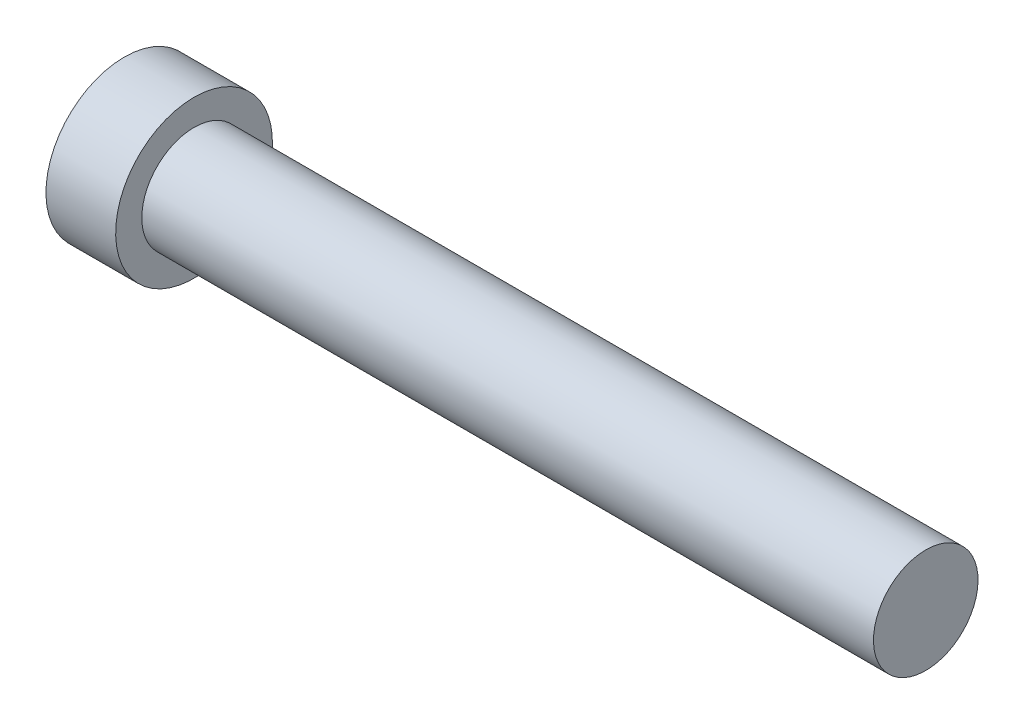
ISO-10303-21;
HEADER;
FILE_DESCRIPTION(('STEP AP214'),'2;1');
FILE_NAME('part.step','',(''),(''),'','','');
FILE_SCHEMA(('AUTOMOTIVE_DESIGN { 1 0 10303 214 1 1 1 1 }'));
ENDSEC;
DATA;
#1=APPLICATION_CONTEXT('core data for automotive mechanical design processes');
#2=APPLICATION_PROTOCOL_DEFINITION('international standard','automotive_design',2000,#1);
#3=PRODUCT_CONTEXT('',#1,'mechanical');
#4=PRODUCT('Part','Part','',(#3));
#5=PRODUCT_RELATED_PRODUCT_CATEGORY('part','',(#4));
#6=PRODUCT_DEFINITION_FORMATION('','',#4);
#7=PRODUCT_DEFINITION_CONTEXT('part definition',#1,'design');
#8=PRODUCT_DEFINITION('design','',#6,#7);
#9=PRODUCT_DEFINITION_SHAPE('','',#8);
#10=(LENGTH_UNIT() NAMED_UNIT(*) SI_UNIT(.MILLI.,.METRE.));
#11=(NAMED_UNIT(*) PLANE_ANGLE_UNIT() SI_UNIT($,.RADIAN.));
#12=(NAMED_UNIT(*) SI_UNIT($,.STERADIAN.) SOLID_ANGLE_UNIT());
#13=UNCERTAINTY_MEASURE_WITH_UNIT(LENGTH_MEASURE(1.E-05),#10,'distance_accuracy_value','');
#14=(GEOMETRIC_REPRESENTATION_CONTEXT(3) GLOBAL_UNCERTAINTY_ASSIGNED_CONTEXT((#13)) GLOBAL_UNIT_ASSIGNED_CONTEXT((#10,
#11,#12)) REPRESENTATION_CONTEXT('',''));
#15=CARTESIAN_POINT('',(0.,0.,0.));
#16=DIRECTION('',(0.,0.,1.));
#17=DIRECTION('',(1.,0.,0.));
#18=AXIS2_PLACEMENT_3D('',#15,#16,#17);
#19=CARTESIAN_POINT('',(0.,0.,0.));
#20=DIRECTION('',(-1.,0.,0.));
#21=DIRECTION('',(0.,-1.,0.));
#22=AXIS2_PLACEMENT_3D('',#19,#20,#21);
#23=PLANE('',#22);
#24=CARTESIAN_POINT('',(0.,0.,0.));
#25=DIRECTION('',(1.,0.,0.));
#26=DIRECTION('',(0.,1.,0.));
#27=AXIS2_PLACEMENT_3D('',#24,#25,#26);
#28=CIRCLE('',#27,22.5);
#29=CARTESIAN_POINT('',(0.,22.5,0.));
#30=VERTEX_POINT('',#29);
#31=EDGE_CURVE('E10',#30,#30,#28,.T.);
#32=ORIENTED_EDGE('',*,*,#31,.F.);
#33=EDGE_LOOP('',(#32));
#34=FACE_BOUND('',#33,.T.);
#35=ADVANCED_FACE('F35',(#34),#23,.T.);
#36=CARTESIAN_POINT('',(230.,0.,0.));
#37=DIRECTION('',(1.,0.,0.));
#38=DIRECTION('',(0.,1.,0.));
#39=AXIS2_PLACEMENT_3D('',#36,#37,#38);
#40=CYLINDRICAL_SURFACE('',#39,22.5);
#41=ORIENTED_EDGE('',*,*,#31,.T.);
#42=EDGE_LOOP('',(#41));
#43=FACE_BOUND('',#42,.T.);
#44=CARTESIAN_POINT('',(20.,0.,0.));
#45=DIRECTION('',(1.,0.,0.));
#46=DIRECTION('',(0.,1.,0.));
#47=AXIS2_PLACEMENT_3D('',#44,#45,#46);
#48=CIRCLE('',#47,22.5);
#49=CARTESIAN_POINT('',(20.,22.5,0.));
#50=VERTEX_POINT('',#49);
#51=EDGE_CURVE('E41',#50,#50,#48,.T.);
#52=ORIENTED_EDGE('',*,*,#51,.F.);
#53=EDGE_LOOP('',(#52));
#54=FACE_BOUND('',#53,.T.);
#55=ADVANCED_FACE('F67',(#43,#54),#40,.T.);
#56=CARTESIAN_POINT('',(20.,22.5,0.));
#57=DIRECTION('',(1.,0.,0.));
#58=DIRECTION('',(0.,1.,0.));
#59=AXIS2_PLACEMENT_3D('',#56,#57,#58);
#60=PLANE('',#59);
#61=ORIENTED_EDGE('',*,*,#51,.T.);
#62=EDGE_LOOP('',(#61));
#63=FACE_BOUND('',#62,.T.);
#64=CARTESIAN_POINT('',(20.,0.,0.));
#65=DIRECTION('',(1.,0.,0.));
#66=DIRECTION('',(0.,1.,0.));
#67=AXIS2_PLACEMENT_3D('',#64,#65,#66);
#68=CIRCLE('',#67,15.);
#69=CARTESIAN_POINT('',(20.,15.,0.));
#70=VERTEX_POINT('',#69);
#71=EDGE_CURVE('E45',#70,#70,#68,.T.);
#72=ORIENTED_EDGE('',*,*,#71,.F.);
#73=EDGE_LOOP('',(#72));
#74=FACE_BOUND('',#73,.T.);
#75=ADVANCED_FACE('F59',(#63,#74),#60,.T.);
#76=CARTESIAN_POINT('',(230.,0.,0.));
#77=DIRECTION('',(1.,0.,0.));
#78=DIRECTION('',(0.,1.,0.));
#79=AXIS2_PLACEMENT_3D('',#76,#77,#78);
#80=CYLINDRICAL_SURFACE('',#79,15.);
#81=ORIENTED_EDGE('',*,*,#71,.T.);
#82=EDGE_LOOP('',(#81));
#83=FACE_BOUND('',#82,.T.);
#84=CARTESIAN_POINT('',(230.,0.,0.));
#85=DIRECTION('',(1.,0.,0.));
#86=DIRECTION('',(0.,1.,0.));
#87=AXIS2_PLACEMENT_3D('',#84,#85,#86);
#88=CIRCLE('',#87,15.);
#89=CARTESIAN_POINT('',(230.,15.,0.));
#90=VERTEX_POINT('',#89);
#91=EDGE_CURVE('E49',#90,#90,#88,.T.);
#92=ORIENTED_EDGE('',*,*,#91,.F.);
#93=EDGE_LOOP('',(#92));
#94=FACE_BOUND('',#93,.T.);
#95=ADVANCED_FACE('F57',(#83,#94),#80,.T.);
#96=CARTESIAN_POINT('',(230.,15.,0.));
#97=DIRECTION('',(1.,0.,0.));
#98=DIRECTION('',(0.,1.,0.));
#99=AXIS2_PLACEMENT_3D('',#96,#97,#98);
#100=PLANE('',#99);
#101=ORIENTED_EDGE('',*,*,#91,.T.);
#102=EDGE_LOOP('',(#101));
#103=FACE_BOUND('',#102,.T.);
#104=ADVANCED_FACE('F55',(#103),#100,.T.);
#105=CLOSED_SHELL('',(#35,#55,#75,#95,#104));
#106=MANIFOLD_SOLID_BREP('B2',#105);
#107=ADVANCED_BREP_SHAPE_REPRESENTATION('',(#18,#106),#14);
#108=SHAPE_DEFINITION_REPRESENTATION(#9,#107);
ENDSEC;
END-ISO-10303-21;
